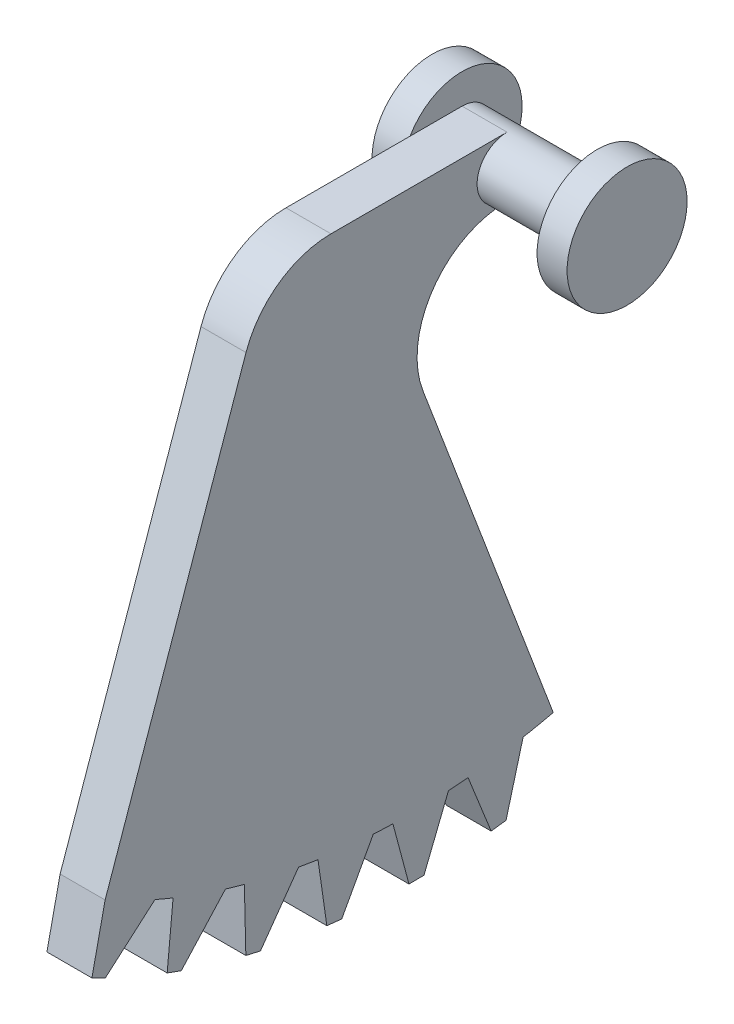
ISO-10303-21;
HEADER;
FILE_DESCRIPTION(('STEP AP214'),'2;1');
FILE_NAME('part.step','',(''),(''),'','','');
FILE_SCHEMA(('AUTOMOTIVE_DESIGN { 1 0 10303 214 1 1 1 1 }'));
ENDSEC;
DATA;
#1=APPLICATION_CONTEXT('core data for automotive mechanical design processes');
#2=APPLICATION_PROTOCOL_DEFINITION('international standard','automotive_design',2000,#1);
#3=PRODUCT_CONTEXT('',#1,'mechanical');
#4=PRODUCT('Part','Part','',(#3));
#5=PRODUCT_RELATED_PRODUCT_CATEGORY('part','',(#4));
#6=PRODUCT_DEFINITION_FORMATION('','',#4);
#7=PRODUCT_DEFINITION_CONTEXT('part definition',#1,'design');
#8=PRODUCT_DEFINITION('design','',#6,#7);
#9=PRODUCT_DEFINITION_SHAPE('','',#8);
#10=(LENGTH_UNIT() NAMED_UNIT(*) SI_UNIT(.MILLI.,.METRE.));
#11=(NAMED_UNIT(*) PLANE_ANGLE_UNIT() SI_UNIT($,.RADIAN.));
#12=(NAMED_UNIT(*) SI_UNIT($,.STERADIAN.) SOLID_ANGLE_UNIT());
#13=UNCERTAINTY_MEASURE_WITH_UNIT(LENGTH_MEASURE(1.E-05),#10,'distance_accuracy_value','');
#14=(GEOMETRIC_REPRESENTATION_CONTEXT(3) GLOBAL_UNCERTAINTY_ASSIGNED_CONTEXT((#13)) GLOBAL_UNIT_ASSIGNED_CONTEXT((#10,
#11,#12)) REPRESENTATION_CONTEXT('',''));
#15=CARTESIAN_POINT('',(0.,0.,0.));
#16=DIRECTION('',(0.,0.,1.));
#17=DIRECTION('',(1.,0.,0.));
#18=AXIS2_PLACEMENT_3D('',#15,#16,#17);
#19=CARTESIAN_POINT('',(-8.,8.12,6.47));
#20=DIRECTION('',(-1.,0.,0.));
#21=DIRECTION('',(0.,0.,1.));
#22=AXIS2_PLACEMENT_3D('',#19,#20,#21);
#23=CYLINDRICAL_SURFACE('',#22,42.26);
#24=DIRECTION('',(-1.,0.,0.));
#25=VECTOR('',#24,1.);
#26=CARTESIAN_POINT('',(-8.,-31.0770324874639,22.2655767282079));
#27=LINE('',#26,#25);
#28=CARTESIAN_POINT('',(-8.,-31.0770324874639,22.2655767282079));
#29=VERTEX_POINT('',#28);
#30=CARTESIAN_POINT('',(-11.,-31.0770324874639,22.2655767282079));
#31=VERTEX_POINT('',#30);
#32=EDGE_CURVE('E247',#29,#31,#27,.T.);
#33=ORIENTED_EDGE('',*,*,#32,.F.);
#34=CARTESIAN_POINT('',(-8.,8.12,6.47));
#35=DIRECTION('',(1.,0.,0.));
#36=DIRECTION('',(0.,0.,-1.));
#37=AXIS2_PLACEMENT_3D('',#34,#35,#36);
#38=CIRCLE('',#37,42.26);
#39=CARTESIAN_POINT('',(-8.,-30.5684682169388,23.4732357810775));
#40=VERTEX_POINT('',#39);
#41=EDGE_CURVE('E265',#40,#29,#38,.T.);
#42=ORIENTED_EDGE('',*,*,#41,.F.);
#43=DIRECTION('',(-1.,0.,0.));
#44=VECTOR('',#43,1.);
#45=CARTESIAN_POINT('',(-8.,-30.5684682169388,23.4732357810775));
#46=LINE('',#45,#44);
#47=CARTESIAN_POINT('',(-11.,-30.5684682169388,23.4732357810775));
#48=VERTEX_POINT('',#47);
#49=EDGE_CURVE('E304',#40,#48,#46,.T.);
#50=ORIENTED_EDGE('',*,*,#49,.T.);
#51=CARTESIAN_POINT('',(-11.,8.12,6.47));
#52=DIRECTION('',(1.,0.,0.));
#53=DIRECTION('',(0.,0.,-1.));
#54=AXIS2_PLACEMENT_3D('',#51,#52,#53);
#55=CIRCLE('',#54,42.26);
#56=EDGE_CURVE('E262',#48,#31,#55,.T.);
#57=ORIENTED_EDGE('',*,*,#56,.T.);
#58=EDGE_LOOP('',(#33,#42,#50,#57));
#59=FACE_BOUND('',#58,.T.);
#60=ADVANCED_FACE('F43',(#59),#23,.T.);
#61=CARTESIAN_POINT('',(-8.,-32.3095650914269,18.7727584922274));
#62=VERTEX_POINT('',#61);
#63=CARTESIAN_POINT('',(-8.,-32.6715602464926,17.5133786794062));
#64=VERTEX_POINT('',#63);
#65=EDGE_CURVE('E273',#62,#64,#38,.T.);
#66=ORIENTED_EDGE('',*,*,#65,.F.);
#67=DIRECTION('',(-1.,0.,0.));
#68=VECTOR('',#67,1.);
#69=CARTESIAN_POINT('',(-8.,-32.3095650914269,18.7727584922274));
#70=LINE('',#69,#68);
#71=CARTESIAN_POINT('',(-11.,-32.3095650914269,18.7727584922274));
#72=VERTEX_POINT('',#71);
#73=EDGE_CURVE('E421',#62,#72,#70,.T.);
#74=ORIENTED_EDGE('',*,*,#73,.T.);
#75=CARTESIAN_POINT('',(-11.,-32.6715602464926,17.5133786794062));
#76=VERTEX_POINT('',#75);
#77=EDGE_CURVE('E447',#72,#76,#55,.T.);
#78=ORIENTED_EDGE('',*,*,#77,.T.);
#79=DIRECTION('',(-1.,0.,0.));
#80=VECTOR('',#79,1.);
#81=CARTESIAN_POINT('',(-8.,-32.6715602464926,17.5133786794062));
#82=LINE('',#81,#80);
#83=EDGE_CURVE('E393',#64,#76,#82,.T.);
#84=ORIENTED_EDGE('',*,*,#83,.F.);
#85=EDGE_LOOP('',(#66,#74,#78,#84));
#86=FACE_BOUND('',#85,.T.);
#87=ADVANCED_FACE('F443',(#86),#23,.T.);
#88=CARTESIAN_POINT('',(-8.,-33.4818590701313,13.8991938936156));
#89=VERTEX_POINT('',#88);
#90=CARTESIAN_POINT('',(-8.,-33.69219220577,12.605811515011));
#91=VERTEX_POINT('',#90);
#92=EDGE_CURVE('E278',#89,#91,#38,.T.);
#93=ORIENTED_EDGE('',*,*,#92,.F.);
#94=DIRECTION('',(-1.,0.,0.));
#95=VECTOR('',#94,1.);
#96=CARTESIAN_POINT('',(-8.,-33.4818590701313,13.8991938936156));
#97=LINE('',#96,#95);
#98=CARTESIAN_POINT('',(-11.,-33.4818590701313,13.8991938936156));
#99=VERTEX_POINT('',#98);
#100=EDGE_CURVE('E402',#89,#99,#97,.T.);
#101=ORIENTED_EDGE('',*,*,#100,.T.);
#102=CARTESIAN_POINT('',(-11.,-33.69219220577,12.605811515011));
#103=VERTEX_POINT('',#102);
#104=EDGE_CURVE('E454',#99,#103,#55,.T.);
#105=ORIENTED_EDGE('',*,*,#104,.T.);
#106=DIRECTION('',(-1.,0.,0.));
#107=VECTOR('',#106,1.);
#108=CARTESIAN_POINT('',(-8.,-33.69219220577,12.605811515011));
#109=LINE('',#108,#107);
#110=EDGE_CURVE('E366',#91,#103,#109,.T.);
#111=ORIENTED_EDGE('',*,*,#110,.F.);
#112=EDGE_LOOP('',(#93,#101,#105,#111));
#113=FACE_BOUND('',#112,.T.);
#114=ADVANCED_FACE('F596',(#113),#23,.T.);
#115=CARTESIAN_POINT('',(-8.,-34.068857168072,8.92110808656464));
#116=VERTEX_POINT('',#115);
#117=CARTESIAN_POINT('',(-8.,-34.1245691108087,7.61191971789151));
#118=VERTEX_POINT('',#117);
#119=EDGE_CURVE('E287',#116,#118,#38,.T.);
#120=ORIENTED_EDGE('',*,*,#119,.F.);
#121=DIRECTION('',(-1.,0.,0.));
#122=VECTOR('',#121,1.);
#123=CARTESIAN_POINT('',(-8.,-34.068857168072,8.92110808656464));
#124=LINE('',#123,#122);
#125=CARTESIAN_POINT('',(-11.,-34.068857168072,8.92110808656464));
#126=VERTEX_POINT('',#125);
#127=EDGE_CURVE('E374',#116,#126,#124,.T.);
#128=ORIENTED_EDGE('',*,*,#127,.T.);
#129=CARTESIAN_POINT('',(-11.,-34.1245691108087,7.61191971789151));
#130=VERTEX_POINT('',#129);
#131=EDGE_CURVE('E460',#126,#130,#55,.T.);
#132=ORIENTED_EDGE('',*,*,#131,.T.);
#133=DIRECTION('',(-1.,0.,0.));
#134=VECTOR('',#133,1.);
#135=CARTESIAN_POINT('',(-8.,-34.1245691108087,7.61191971789151));
#136=LINE('',#135,#134);
#137=EDGE_CURVE('E341',#118,#130,#136,.T.);
#138=ORIENTED_EDGE('',*,*,#137,.F.);
#139=EDGE_LOOP('',(#120,#128,#132,#138));
#140=FACE_BOUND('',#139,.T.);
#141=ADVANCED_FACE('F527',(#140),#23,.T.);
#142=CARTESIAN_POINT('',(-8.,-34.0623009185261,3.9085376795838));
#143=VERTEX_POINT('',#142);
#144=CARTESIAN_POINT('',(-8.,-33.9626078579416,2.60196227077502));
#145=VERTEX_POINT('',#144);
#146=EDGE_CURVE('E282',#143,#145,#38,.T.);
#147=ORIENTED_EDGE('',*,*,#146,.F.);
#148=DIRECTION('',(-1.,0.,0.));
#149=VECTOR('',#148,1.);
#150=CARTESIAN_POINT('',(-8.,-34.0623009185261,3.9085376795838));
#151=LINE('',#150,#149);
#152=CARTESIAN_POINT('',(-11.,-34.0623009185261,3.9085376795838));
#153=VERTEX_POINT('',#152);
#154=EDGE_CURVE('E352',#143,#153,#151,.T.);
#155=ORIENTED_EDGE('',*,*,#154,.T.);
#156=CARTESIAN_POINT('',(-11.,-33.9626078579416,2.60196227077502));
#157=VERTEX_POINT('',#156);
#158=EDGE_CURVE('E513',#153,#157,#55,.T.);
#159=ORIENTED_EDGE('',*,*,#158,.T.);
#160=DIRECTION('',(-1.,0.,0.));
#161=VECTOR('',#160,1.);
#162=CARTESIAN_POINT('',(-8.,-33.9626078579416,2.60196227077502));
#163=LINE('',#162,#161);
#164=EDGE_CURVE('E321',#145,#157,#163,.T.);
#165=ORIENTED_EDGE('',*,*,#164,.F.);
#166=EDGE_LOOP('',(#147,#155,#159,#165));
#167=FACE_BOUND('',#166,.T.);
#168=ADVANCED_FACE('F545',(#167),#23,.T.);
#169=CARTESIAN_POINT('',(-11.,0.,0.));
#170=DIRECTION('',(1.,0.,0.));
#171=DIRECTION('',(0.,0.,-1.));
#172=AXIS2_PLACEMENT_3D('',#169,#170,#171);
#173=PLANE('',#172);
#174=CARTESIAN_POINT('',(-11.,0.,0.));
#175=DIRECTION('',(1.,0.,0.));
#176=DIRECTION('',(0.,0.,-1.));
#177=AXIS2_PLACEMENT_3D('',#174,#175,#176);
#178=CIRCLE('',#177,4.);
#179=CARTESIAN_POINT('',(-11.,-2.75,2.90473750965556));
#180=VERTEX_POINT('',#179);
#181=CARTESIAN_POINT('',(-11.,2.,3.46410161513775));
#182=VERTEX_POINT('',#181);
#183=EDGE_CURVE('E479',#180,#182,#178,.T.);
#184=ORIENTED_EDGE('',*,*,#183,.T.);
#185=DIRECTION('',(0.,0.,-1.));
#186=VECTOR('',#185,1.);
#187=CARTESIAN_POINT('',(-11.,2.,0.));
#188=LINE('',#187,#186);
#189=CARTESIAN_POINT('',(-11.,2.,0.));
#190=VERTEX_POINT('',#189);
#191=EDGE_CURVE('E299',#182,#190,#188,.T.);
#192=ORIENTED_EDGE('',*,*,#191,.T.);
#193=CARTESIAN_POINT('',(-11.,0.,0.));
#194=DIRECTION('',(1.,0.,0.));
#195=DIRECTION('',(0.,0.,-1.));
#196=AXIS2_PLACEMENT_3D('',#193,#194,#195);
#197=CIRCLE('',#196,2.);
#198=CARTESIAN_POINT('',(-11.,-2.,0.));
#199=VERTEX_POINT('',#198);
#200=EDGE_CURVE('E483',#199,#190,#197,.T.);
#201=ORIENTED_EDGE('',*,*,#200,.F.);
#202=CARTESIAN_POINT('',(-11.,-8.,0.));
#203=DIRECTION('',(1.,0.,0.));
#204=DIRECTION('',(0.,0.,-1.));
#205=AXIS2_PLACEMENT_3D('',#202,#203,#204);
#206=CIRCLE('',#205,6.);
#207=EDGE_CURVE('E296',#199,#180,#206,.T.);
#208=ORIENTED_EDGE('',*,*,#207,.T.);
#209=EDGE_LOOP('',(#184,#192,#201,#208));
#210=FACE_BOUND('',#209,.T.);
#211=ADVANCED_FACE('F571',(#210),#173,.T.);
#212=CARTESIAN_POINT('',(-2.,0.,0.));
#213=DIRECTION('',(1.,0.,0.));
#214=DIRECTION('',(0.,0.,-1.));
#215=AXIS2_PLACEMENT_3D('',#212,#213,#214);
#216=CYLINDRICAL_SURFACE('',#215,4.);
#217=CARTESIAN_POINT('',(-2.,0.,0.));
#218=DIRECTION('',(1.,0.,0.));
#219=DIRECTION('',(0.,0.,-1.));
#220=AXIS2_PLACEMENT_3D('',#217,#218,#219);
#221=CIRCLE('',#220,4.);
#222=CARTESIAN_POINT('',(-2.,0.,-4.));
#223=VERTEX_POINT('',#222);
#224=EDGE_CURVE('E492',#223,#223,#221,.T.);
#225=ORIENTED_EDGE('',*,*,#224,.T.);
#226=EDGE_LOOP('',(#225));
#227=FACE_BOUND('',#226,.T.);
#228=CARTESIAN_POINT('',(0.,0.,0.));
#229=DIRECTION('',(1.,0.,0.));
#230=DIRECTION('',(0.,0.,-1.));
#231=AXIS2_PLACEMENT_3D('',#228,#229,#230);
#232=CIRCLE('',#231,4.);
#233=CARTESIAN_POINT('',(0.,0.,-4.));
#234=VERTEX_POINT('',#233);
#235=EDGE_CURVE('E495',#234,#234,#232,.T.);
#236=ORIENTED_EDGE('',*,*,#235,.F.);
#237=EDGE_LOOP('',(#236));
#238=FACE_BOUND('',#237,.T.);
#239=ADVANCED_FACE('F608',(#227,#238),#216,.T.);
#240=CARTESIAN_POINT('',(-2.,0.,0.));
#241=DIRECTION('',(1.,0.,0.));
#242=DIRECTION('',(0.,0.,-1.));
#243=AXIS2_PLACEMENT_3D('',#240,#241,#242);
#244=PLANE('',#243);
#245=CARTESIAN_POINT('',(-2.,0.,0.));
#246=DIRECTION('',(1.,0.,0.));
#247=DIRECTION('',(0.,0.,-1.));
#248=AXIS2_PLACEMENT_3D('',#245,#246,#247);
#249=CIRCLE('',#248,2.);
#250=CARTESIAN_POINT('',(-2.,0.,-2.));
#251=VERTEX_POINT('',#250);
#252=EDGE_CURVE('E487',#251,#251,#249,.T.);
#253=ORIENTED_EDGE('',*,*,#252,.T.);
#254=EDGE_LOOP('',(#253));
#255=FACE_BOUND('',#254,.T.);
#256=ORIENTED_EDGE('',*,*,#224,.F.);
#257=EDGE_LOOP('',(#256));
#258=FACE_BOUND('',#257,.T.);
#259=ADVANCED_FACE('F929',(#255,#258),#244,.F.);
#260=CARTESIAN_POINT('',(0.,0.,0.));
#261=DIRECTION('',(1.,0.,0.));
#262=DIRECTION('',(0.,0.,-1.));
#263=AXIS2_PLACEMENT_3D('',#260,#261,#262);
#264=PLANE('',#263);
#265=ORIENTED_EDGE('',*,*,#235,.T.);
#266=EDGE_LOOP('',(#265));
#267=FACE_BOUND('',#266,.T.);
#268=ADVANCED_FACE('F590',(#267),#264,.T.);
#269=CARTESIAN_POINT('',(-11.,0.,0.));
#270=DIRECTION('',(1.,0.,0.));
#271=DIRECTION('',(0.,0.,-1.));
#272=AXIS2_PLACEMENT_3D('',#269,#270,#271);
#273=CYLINDRICAL_SURFACE('',#272,2.);
#274=DIRECTION('',(-1.,0.,0.));
#275=VECTOR('',#274,1.);
#276=CARTESIAN_POINT('',(-8.,2.,0.));
#277=LINE('',#276,#275);
#278=CARTESIAN_POINT('',(-8.,2.,0.));
#279=VERTEX_POINT('',#278);
#280=EDGE_CURVE('E465',#279,#190,#277,.T.);
#281=ORIENTED_EDGE('',*,*,#280,.F.);
#282=CARTESIAN_POINT('',(-8.,0.,0.));
#283=DIRECTION('',(1.,0.,0.));
#284=DIRECTION('',(0.,0.,-1.));
#285=AXIS2_PLACEMENT_3D('',#282,#283,#284);
#286=CIRCLE('',#285,2.);
#287=CARTESIAN_POINT('',(-8.,-2.,0.));
#288=VERTEX_POINT('',#287);
#289=EDGE_CURVE('E512',#288,#279,#286,.F.);
#290=ORIENTED_EDGE('',*,*,#289,.F.);
#291=DIRECTION('',(-1.,0.,0.));
#292=VECTOR('',#291,1.);
#293=CARTESIAN_POINT('',(-8.,-2.,0.));
#294=LINE('',#293,#292);
#295=EDGE_CURVE('E467',#288,#199,#294,.T.);
#296=ORIENTED_EDGE('',*,*,#295,.T.);
#297=ORIENTED_EDGE('',*,*,#200,.T.);
#298=EDGE_LOOP('',(#281,#290,#296,#297));
#299=FACE_BOUND('',#298,.T.);
#300=ORIENTED_EDGE('',*,*,#252,.F.);
#301=EDGE_LOOP('',(#300));
#302=FACE_BOUND('',#301,.T.);
#303=ADVANCED_FACE('F570',(#299,#302),#273,.T.);
#304=CARTESIAN_POINT('',(-13.,0.,0.));
#305=DIRECTION('',(1.,0.,0.));
#306=DIRECTION('',(0.,0.,-1.));
#307=AXIS2_PLACEMENT_3D('',#304,#305,#306);
#308=CYLINDRICAL_SURFACE('',#307,4.);
#309=CARTESIAN_POINT('',(-13.,0.,0.));
#310=DIRECTION('',(1.,0.,0.));
#311=DIRECTION('',(0.,0.,-1.));
#312=AXIS2_PLACEMENT_3D('',#309,#310,#311);
#313=CIRCLE('',#312,4.);
#314=CARTESIAN_POINT('',(-13.,0.,-4.));
#315=VERTEX_POINT('',#314);
#316=EDGE_CURVE('E477',#315,#315,#313,.T.);
#317=ORIENTED_EDGE('',*,*,#316,.T.);
#318=EDGE_LOOP('',(#317));
#319=FACE_BOUND('',#318,.T.);
#320=EDGE_CURVE('E482',#182,#180,#178,.T.);
#321=ORIENTED_EDGE('',*,*,#320,.F.);
#322=ORIENTED_EDGE('',*,*,#183,.F.);
#323=EDGE_LOOP('',(#321,#322));
#324=FACE_BOUND('',#323,.T.);
#325=ADVANCED_FACE('F575',(#319,#324),#308,.T.);
#326=CARTESIAN_POINT('',(-13.,0.,0.));
#327=DIRECTION('',(1.,0.,0.));
#328=DIRECTION('',(0.,0.,-1.));
#329=AXIS2_PLACEMENT_3D('',#326,#327,#328);
#330=PLANE('',#329);
#331=ORIENTED_EDGE('',*,*,#316,.F.);
#332=EDGE_LOOP('',(#331));
#333=FACE_BOUND('',#332,.T.);
#334=ADVANCED_FACE('F580',(#333),#330,.F.);
#335=CARTESIAN_POINT('',(-11.,0.,0.));
#336=DIRECTION('',(1.,0.,0.));
#337=DIRECTION('',(0.,0.,-1.));
#338=AXIS2_PLACEMENT_3D('',#335,#336,#337);
#339=PLANE('',#338);
#340=DIRECTION('',(0.,0.944146547885924,-0.329525865623767));
#341=VECTOR('',#340,1.);
#342=CARTESIAN_POINT('',(-11.,5.195105927715,14.8848446790941));
#343=LINE('',#342,#341);
#344=CARTESIAN_POINT('',(-11.,-28.9310423138733,26.7955470641153));
#345=VERTEX_POINT('',#344);
#346=CARTESIAN_POINT('',(-11.,-2.0228448062574,17.4040526018131));
#347=VERTEX_POINT('',#346);
#348=EDGE_CURVE('E305',#345,#347,#343,.T.);
#349=ORIENTED_EDGE('',*,*,#348,.T.);
#350=CARTESIAN_POINT('',(-11.,-4.,11.7391733144975));
#351=DIRECTION('',(1.,0.,0.));
#352=DIRECTION('',(0.,0.,-1.));
#353=AXIS2_PLACEMENT_3D('',#350,#351,#352);
#354=CIRCLE('',#353,6.);
#355=CARTESIAN_POINT('',(-11.,2.,11.7391733144975));
#356=VERTEX_POINT('',#355);
#357=EDGE_CURVE('E498',#347,#356,#354,.F.);
#358=ORIENTED_EDGE('',*,*,#357,.T.);
#359=EDGE_CURVE('E286',#356,#182,#188,.T.);
#360=ORIENTED_EDGE('',*,*,#359,.T.);
#361=ORIENTED_EDGE('',*,*,#320,.T.);
#362=CARTESIAN_POINT('',(-11.,-10.126725466906,5.610440159953));
#363=VERTEX_POINT('',#362);
#364=EDGE_CURVE('E464',#180,#363,#206,.T.);
#365=ORIENTED_EDGE('',*,*,#364,.T.);
#366=DIRECTION('',(0.,0.935073359992166,0.354454244484336));
#367=VECTOR('',#366,1.);
#368=CARTESIAN_POINT('',(-11.,-3.1318279583697,8.26196593078062));
#369=LINE('',#368,#367);
#370=CARTESIAN_POINT('',(-11.,-33.0472709861766,-3.07795263659715));
#371=VERTEX_POINT('',#370);
#372=EDGE_CURVE('E455',#371,#363,#369,.T.);
#373=ORIENTED_EDGE('',*,*,#372,.F.);
#374=CARTESIAN_POINT('',(-11.,-33.4622825612623,-1.06799555554028));
#375=VERTEX_POINT('',#374);
#376=EDGE_CURVE('E451',#375,#371,#55,.T.);
#377=ORIENTED_EDGE('',*,*,#376,.F.);
#378=DIRECTION('',(0.,-0.965744901133336,0.259493325415055));
#379=VECTOR('',#378,1.);
#380=CARTESIAN_POINT('',(-11.,3.00891069389777,-10.8677172092919));
#381=LINE('',#380,#379);
#382=CARTESIAN_POINT('',(-11.,-37.6950537450641,0.0693398514774388));
#383=VERTEX_POINT('',#382);
#384=EDGE_CURVE('E59',#375,#383,#381,.T.);
#385=ORIENTED_EDGE('',*,*,#384,.T.);
#386=DIRECTION('',(0.,-0.127650139538664,0.991819258673555));
#387=VECTOR('',#386,1.);
#388=CARTESIAN_POINT('',(-11.,-36.555646651557,-8.78365398694573));
#389=LINE('',#388,#387);
#390=CARTESIAN_POINT('',(-11.,-37.8227038846028,1.06115911015099));
#391=VERTEX_POINT('',#390);
#392=EDGE_CURVE('E334',#383,#391,#389,.T.);
#393=ORIENTED_EDGE('',*,*,#392,.T.);
#394=DIRECTION('',(0.,0.92874486425215,0.370719539713321));
#395=VECTOR('',#394,1.);
#396=CARTESIAN_POINT('',(-11.,-2.42778933630494,15.1894595019956));
#397=LINE('',#396,#395);
#398=EDGE_CURVE('E336',#391,#157,#397,.T.);
#399=ORIENTED_EDGE('',*,*,#398,.T.);
#400=ORIENTED_EDGE('',*,*,#158,.F.);
#401=DIRECTION('',(0.,-0.928226336976967,0.372015950386971));
#402=VECTOR('',#401,1.);
#403=CARTESIAN_POINT('',(-11.,0.992010091232233,-10.1405819219206));
#404=LINE('',#403,#402);
#405=CARTESIAN_POINT('',(-11.,-38.1306316822623,5.53904941499626));
#406=VERTEX_POINT('',#405);
#407=EDGE_CURVE('E68',#153,#406,#404,.T.);
#408=ORIENTED_EDGE('',*,*,#407,.T.);
#409=DIRECTION('',(0.,-0.00931684959711915,0.999956597214892));
#410=VECTOR('',#409,1.);
#411=CARTESIAN_POINT('',(-11.,-38.0474693405801,-3.38657843142546));
#412=LINE('',#411,#410);
#413=CARTESIAN_POINT('',(-11.,-38.1399485318594,6.53900601221114));
#414=VERTEX_POINT('',#413);
#415=EDGE_CURVE('E360',#406,#414,#412,.T.);
#416=ORIENTED_EDGE('',*,*,#415,.T.);
#417=DIRECTION('',(0.,0.966106280664289,0.258144638644721));
#418=VECTOR('',#417,1.);
#419=CARTESIAN_POINT('',(-11.,-1.32117239120064,16.3770226490929));
#420=LINE('',#419,#418);
#421=EDGE_CURVE('E323',#414,#130,#420,.T.);
#422=ORIENTED_EDGE('',*,*,#421,.T.);
#423=ORIENTED_EDGE('',*,*,#131,.F.);
#424=DIRECTION('',(0.,-0.877648571535072,0.479304688984416));
#425=VECTOR('',#424,1.);
#426=CARTESIAN_POINT('',(-11.,-0.924606936973481,-9.17975262679832));
#427=LINE('',#426,#425);
#428=CARTESIAN_POINT('',(-11.,-37.9155102321875,11.0218565072019));
#429=VERTEX_POINT('',#428);
#430=EDGE_CURVE('E377',#126,#429,#427,.T.);
#431=ORIENTED_EDGE('',*,*,#430,.T.);
#432=DIRECTION('',(0.,0.109147518950353,0.994025562602382));
#433=VECTOR('',#432,1.);
#434=CARTESIAN_POINT('',(-11.,-38.8897626519671,2.14916916624109));
#435=LINE('',#434,#433);
#436=CARTESIAN_POINT('',(-11.,-37.8063627132372,12.0158820698043));
#437=VERTEX_POINT('',#436);
#438=EDGE_CURVE('E382',#429,#437,#435,.T.);
#439=ORIENTED_EDGE('',*,*,#438,.T.);
#440=DIRECTION('',(0.,0.989875563477315,0.141937904840348));
#441=VECTOR('',#440,1.);
#442=CARTESIAN_POINT('',(-11.,-0.0817277447949629,17.4252040551635));
#443=LINE('',#442,#441);
#444=EDGE_CURVE('E350',#437,#103,#443,.T.);
#445=ORIENTED_EDGE('',*,*,#444,.T.);
#446=ORIENTED_EDGE('',*,*,#104,.F.);
#447=DIRECTION('',(0.,-0.814723182569631,0.579850097683541));
#448=VECTOR('',#447,1.);
#449=CARTESIAN_POINT('',(-11.,-2.71397553682379,-7.99874721570024));
#450=LINE('',#449,#448);
#451=CARTESIAN_POINT('',(-11.,-37.0527159350333,16.4406236040073));
#452=VERTEX_POINT('',#451);
#453=EDGE_CURVE('E403',#99,#452,#450,.T.);
#454=ORIENTED_EDGE('',*,*,#453,.T.);
#455=DIRECTION('',(0.,0.22607629282333,0.97410959846583));
#456=VECTOR('',#455,1.);
#457=CARTESIAN_POINT('',(-11.,-39.0706763747763,7.74570646285385));
#458=LINE('',#457,#456);
#459=CARTESIAN_POINT('',(-11.,-36.82663964221,17.4147332024732));
#460=VERTEX_POINT('',#459);
#461=EDGE_CURVE('E408',#452,#460,#458,.T.);
#462=ORIENTED_EDGE('',*,*,#461,.T.);
#463=DIRECTION('',(0.,0.999718303036705,0.0237342489540253));
#464=VECTOR('',#463,1.);
#465=CARTESIAN_POINT('',(-11.,1.27310687627701,18.3192568729994));
#466=LINE('',#465,#464);
#467=EDGE_CURVE('E367',#460,#76,#466,.T.);
#468=ORIENTED_EDGE('',*,*,#467,.T.);
#469=ORIENTED_EDGE('',*,*,#77,.F.);
#470=DIRECTION('',(0.,-0.740335466357785,0.672237604759509));
#471=VECTOR('',#470,1.);
#472=CARTESIAN_POINT('',(-11.,-4.35092111049858,-6.61418123460734));
#473=LINE('',#472,#471);
#474=CARTESIAN_POINT('',(-11.,-35.5543874297777,21.7191141589824));
#475=VERTEX_POINT('',#474);
#476=EDGE_CURVE('E258',#72,#475,#473,.T.);
#477=ORIENTED_EDGE('',*,*,#476,.T.);
#478=DIRECTION('',(0.,0.339824402997967,0.940488902181773));
#479=VECTOR('',#478,1.);
#480=CARTESIAN_POINT('',(-11.,-38.5876652367748,13.3242958659238));
#481=LINE('',#480,#479);
#482=CARTESIAN_POINT('',(-11.,-35.2145630267797,22.6596030611642));
#483=VERTEX_POINT('',#482);
#484=EDGE_CURVE('E427',#475,#483,#481,.T.);
#485=ORIENTED_EDGE('',*,*,#484,.T.);
#486=DIRECTION('',(0.,0.995496021999177,-0.0948033236960264));
#487=VECTOR('',#486,1.);
#488=CARTESIAN_POINT('',(-11.,2.72427032569747,19.046602688002));
#489=LINE('',#488,#487);
#490=EDGE_CURVE('E398',#483,#31,#489,.T.);
#491=ORIENTED_EDGE('',*,*,#490,.T.);
#492=ORIENTED_EDGE('',*,*,#56,.F.);
#493=DIRECTION('',(0.,-0.655531982472865,0.755167411873153));
#494=VECTOR('',#493,1.);
#495=CARTESIAN_POINT('',(-11.,-5.81241349726172,-5.04553411985954));
#496=LINE('',#495,#494);
#497=CARTESIAN_POINT('',(-11.,-33.4416046758686,26.7830651740898));
#498=VERTEX_POINT('',#497);
#499=EDGE_CURVE('E307',#48,#498,#496,.T.);
#500=ORIENTED_EDGE('',*,*,#499,.T.);
#501=DIRECTION('',(0.,0.448791529156423,0.893636482781136));
#502=VECTOR('',#501,1.);
#503=CARTESIAN_POINT('',(-11.,-37.4475247138319,18.8064522915853));
#504=LINE('',#503,#502);
#505=CARTESIAN_POINT('',(-11.,-32.9928131467121,27.676701656871));
#506=VERTEX_POINT('',#505);
#507=EDGE_CURVE('E313',#498,#506,#504,.T.);
#508=ORIENTED_EDGE('',*,*,#507,.T.);
#509=DIRECTION('',(0.,0.977268123568194,-0.212007109922052));
#510=VECTOR('',#509,1.);
#511=CARTESIAN_POINT('',(-11.,4.25134620842432,19.5970084836926));
#512=LINE('',#511,#510);
#513=EDGE_CURVE('E264',#506,#345,#512,.T.);
#514=ORIENTED_EDGE('',*,*,#513,.T.);
#515=EDGE_LOOP('',(#349,#358,#360,#361,#365,#373,#377,#385,#393,#399,#400,#408,#416,#422,#423,
#431,#439,#445,#446,#454,#462,#468,#469,#477,#485,#491,#492,#500,#508,#514));
#516=FACE_BOUND('',#515,.T.);
#517=ADVANCED_FACE('F450',(#516),#339,.F.);
#518=CARTESIAN_POINT('',(-8.,5.195105927715,14.8848446790941));
#519=DIRECTION('',(0.,0.329525865623767,0.944146547885924));
#520=DIRECTION('',(0.,-0.944146547885924,0.329525865623767));
#521=AXIS2_PLACEMENT_3D('',#518,#519,#520);
#522=PLANE('',#521);
#523=DIRECTION('',(0.,0.944146547885924,-0.329525865623767));
#524=VECTOR('',#523,1.);
#525=CARTESIAN_POINT('',(-8.,5.195105927715,14.8848446790941));
#526=LINE('',#525,#524);
#527=CARTESIAN_POINT('',(-8.,-28.9310423138733,26.7955470641153));
#528=VERTEX_POINT('',#527);
#529=CARTESIAN_POINT('',(-8.,-2.0228448062574,17.4040526018131));
#530=VERTEX_POINT('',#529);
#531=EDGE_CURVE('E284',#528,#530,#526,.T.);
#532=ORIENTED_EDGE('',*,*,#531,.T.);
#533=DIRECTION('',(-1.,0.,0.));
#534=VECTOR('',#533,1.);
#535=CARTESIAN_POINT('',(-8.,-2.0228448062574,17.4040526018131));
#536=LINE('',#535,#534);
#537=EDGE_CURVE('E499',#530,#347,#536,.T.);
#538=ORIENTED_EDGE('',*,*,#537,.T.);
#539=ORIENTED_EDGE('',*,*,#348,.F.);
#540=DIRECTION('',(-1.,0.,0.));
#541=VECTOR('',#540,1.);
#542=CARTESIAN_POINT('',(-8.,-28.9310423138733,26.7955470641153));
#543=LINE('',#542,#541);
#544=EDGE_CURVE('E480',#528,#345,#543,.T.);
#545=ORIENTED_EDGE('',*,*,#544,.F.);
#546=EDGE_LOOP('',(#532,#538,#539,#545));
#547=FACE_BOUND('',#546,.T.);
#548=ADVANCED_FACE('F511',(#547),#522,.T.);
#549=CARTESIAN_POINT('',(-8.,-33.4622825612623,-1.06799555554028));
#550=VERTEX_POINT('',#549);
#551=CARTESIAN_POINT('',(-8.,-33.0472709861766,-3.07795263659715));
#552=VERTEX_POINT('',#551);
#553=EDGE_CURVE('E277',#550,#552,#38,.T.);
#554=ORIENTED_EDGE('',*,*,#553,.F.);
#555=DIRECTION('',(-1.,0.,0.));
#556=VECTOR('',#555,1.);
#557=CARTESIAN_POINT('',(-8.,-33.4622825612623,-1.06799555554028));
#558=LINE('',#557,#556);
#559=EDGE_CURVE('E327',#550,#375,#558,.T.);
#560=ORIENTED_EDGE('',*,*,#559,.T.);
#561=ORIENTED_EDGE('',*,*,#376,.T.);
#562=DIRECTION('',(-1.,0.,0.));
#563=VECTOR('',#562,1.);
#564=CARTESIAN_POINT('',(-8.,-33.0472709861766,-3.07795263659715));
#565=LINE('',#564,#563);
#566=EDGE_CURVE('E475',#552,#371,#565,.T.);
#567=ORIENTED_EDGE('',*,*,#566,.F.);
#568=EDGE_LOOP('',(#554,#560,#561,#567));
#569=FACE_BOUND('',#568,.T.);
#570=ADVANCED_FACE('F552',(#569),#23,.T.);
#571=CARTESIAN_POINT('',(-8.,-3.1318279583697,8.26196593078062));
#572=DIRECTION('',(0.,-0.354454244484336,0.935073359992166));
#573=DIRECTION('',(0.,-0.935073359992166,-0.354454244484336));
#574=AXIS2_PLACEMENT_3D('',#571,#572,#573);
#575=PLANE('',#574);
#576=ORIENTED_EDGE('',*,*,#372,.T.);
#577=DIRECTION('',(-1.,0.,0.));
#578=VECTOR('',#577,1.);
#579=CARTESIAN_POINT('',(-8.,-10.126725466906,5.610440159953));
#580=LINE('',#579,#578);
#581=CARTESIAN_POINT('',(-8.,-10.126725466906,5.610440159953));
#582=VERTEX_POINT('',#581);
#583=EDGE_CURVE('E473',#582,#363,#580,.T.);
#584=ORIENTED_EDGE('',*,*,#583,.F.);
#585=DIRECTION('',(0.,0.935073359992166,0.354454244484336));
#586=VECTOR('',#585,1.);
#587=CARTESIAN_POINT('',(-8.,-3.1318279583697,8.26196593078062));
#588=LINE('',#587,#586);
#589=EDGE_CURVE('E272',#552,#582,#588,.T.);
#590=ORIENTED_EDGE('',*,*,#589,.F.);
#591=ORIENTED_EDGE('',*,*,#566,.T.);
#592=EDGE_LOOP('',(#576,#584,#590,#591));
#593=FACE_BOUND('',#592,.T.);
#594=ADVANCED_FACE('F556',(#593),#575,.F.);
#595=CARTESIAN_POINT('',(-8.,-8.,0.));
#596=DIRECTION('',(-1.,0.,0.));
#597=DIRECTION('',(0.,0.,1.));
#598=AXIS2_PLACEMENT_3D('',#595,#596,#597);
#599=CYLINDRICAL_SURFACE('',#598,6.);
#600=ORIENTED_EDGE('',*,*,#207,.F.);
#601=ORIENTED_EDGE('',*,*,#295,.F.);
#602=CARTESIAN_POINT('',(-8.,-8.,0.));
#603=DIRECTION('',(1.,0.,0.));
#604=DIRECTION('',(0.,0.,-1.));
#605=AXIS2_PLACEMENT_3D('',#602,#603,#604);
#606=CIRCLE('',#605,6.);
#607=EDGE_CURVE('E280',#288,#582,#606,.T.);
#608=ORIENTED_EDGE('',*,*,#607,.T.);
#609=ORIENTED_EDGE('',*,*,#583,.T.);
#610=ORIENTED_EDGE('',*,*,#364,.F.);
#611=EDGE_LOOP('',(#600,#601,#608,#609,#610));
#612=FACE_BOUND('',#611,.T.);
#613=ADVANCED_FACE('F565',(#612),#599,.F.);
#614=CARTESIAN_POINT('',(-8.,2.,0.));
#615=DIRECTION('',(0.,1.,0.));
#616=DIRECTION('',(0.,0.,1.));
#617=AXIS2_PLACEMENT_3D('',#614,#615,#616);
#618=PLANE('',#617);
#619=ORIENTED_EDGE('',*,*,#359,.F.);
#620=DIRECTION('',(-1.,0.,0.));
#621=VECTOR('',#620,1.);
#622=CARTESIAN_POINT('',(-8.,2.,11.7391733144975));
#623=LINE('',#622,#621);
#624=CARTESIAN_POINT('',(-8.,2.,11.7391733144975));
#625=VERTEX_POINT('',#624);
#626=EDGE_CURVE('E51',#356,#625,#623,.F.);
#627=ORIENTED_EDGE('',*,*,#626,.T.);
#628=DIRECTION('',(0.,0.,-1.));
#629=VECTOR('',#628,1.);
#630=CARTESIAN_POINT('',(-8.,2.,0.));
#631=LINE('',#630,#629);
#632=EDGE_CURVE('E468',#625,#279,#631,.T.);
#633=ORIENTED_EDGE('',*,*,#632,.T.);
#634=ORIENTED_EDGE('',*,*,#280,.T.);
#635=ORIENTED_EDGE('',*,*,#191,.F.);
#636=EDGE_LOOP('',(#619,#627,#633,#634,#635));
#637=FACE_BOUND('',#636,.T.);
#638=ADVANCED_FACE('F503',(#637),#618,.T.);
#639=CARTESIAN_POINT('',(-8.,0.,0.));
#640=DIRECTION('',(1.,0.,0.));
#641=DIRECTION('',(0.,0.,-1.));
#642=AXIS2_PLACEMENT_3D('',#639,#640,#641);
#643=PLANE('',#642);
#644=ORIENTED_EDGE('',*,*,#632,.F.);
#645=CARTESIAN_POINT('',(-8.,-4.,11.7391733144975));
#646=DIRECTION('',(1.,0.,0.));
#647=DIRECTION('',(0.,0.,-1.));
#648=AXIS2_PLACEMENT_3D('',#645,#646,#647);
#649=CIRCLE('',#648,6.);
#650=EDGE_CURVE('E11',#625,#530,#649,.T.);
#651=ORIENTED_EDGE('',*,*,#650,.T.);
#652=ORIENTED_EDGE('',*,*,#531,.F.);
#653=DIRECTION('',(0.,0.977268123568194,-0.212007109922052));
#654=VECTOR('',#653,1.);
#655=CARTESIAN_POINT('',(-8.,4.25134620842432,19.5970084836926));
#656=LINE('',#655,#654);
#657=CARTESIAN_POINT('',(-8.,-32.9928131467121,27.676701656871));
#658=VERTEX_POINT('',#657);
#659=EDGE_CURVE('E309',#658,#528,#656,.T.);
#660=ORIENTED_EDGE('',*,*,#659,.F.);
#661=DIRECTION('',(0.,0.448791529156423,0.893636482781136));
#662=VECTOR('',#661,1.);
#663=CARTESIAN_POINT('',(-8.,-37.4475247138319,18.8064522915853));
#664=LINE('',#663,#662);
#665=CARTESIAN_POINT('',(-8.,-33.4416046758686,26.7830651740898));
#666=VERTEX_POINT('',#665);
#667=EDGE_CURVE('E320',#666,#658,#664,.T.);
#668=ORIENTED_EDGE('',*,*,#667,.F.);
#669=DIRECTION('',(0.,-0.655531982472865,0.755167411873153));
#670=VECTOR('',#669,1.);
#671=CARTESIAN_POINT('',(-8.,-5.81241349726172,-5.04553411985954));
#672=LINE('',#671,#670);
#673=EDGE_CURVE('E275',#40,#666,#672,.T.);
#674=ORIENTED_EDGE('',*,*,#673,.F.);
#675=ORIENTED_EDGE('',*,*,#41,.T.);
#676=DIRECTION('',(0.,0.995496021999177,-0.0948033236960264));
#677=VECTOR('',#676,1.);
#678=CARTESIAN_POINT('',(-8.,2.72427032569747,19.046602688002));
#679=LINE('',#678,#677);
#680=CARTESIAN_POINT('',(-8.,-35.2145630267797,22.6596030611642));
#681=VERTEX_POINT('',#680);
#682=EDGE_CURVE('E243',#681,#29,#679,.T.);
#683=ORIENTED_EDGE('',*,*,#682,.F.);
#684=DIRECTION('',(0.,0.339824402997967,0.940488902181773));
#685=VECTOR('',#684,1.);
#686=CARTESIAN_POINT('',(-8.,-38.5876652367748,13.3242958659238));
#687=LINE('',#686,#685);
#688=CARTESIAN_POINT('',(-8.,-35.5543874297777,21.7191141589824));
#689=VERTEX_POINT('',#688);
#690=EDGE_CURVE('E254',#689,#681,#687,.T.);
#691=ORIENTED_EDGE('',*,*,#690,.F.);
#692=DIRECTION('',(0.,-0.740335466357785,0.672237604759509));
#693=VECTOR('',#692,1.);
#694=CARTESIAN_POINT('',(-8.,-4.35092111049858,-6.61418123460734));
#695=LINE('',#694,#693);
#696=EDGE_CURVE('E426',#62,#689,#695,.T.);
#697=ORIENTED_EDGE('',*,*,#696,.F.);
#698=ORIENTED_EDGE('',*,*,#65,.T.);
#699=DIRECTION('',(0.,0.999718303036705,0.0237342489540253));
#700=VECTOR('',#699,1.);
#701=CARTESIAN_POINT('',(-8.,1.27310687627701,18.3192568729994));
#702=LINE('',#701,#700);
#703=CARTESIAN_POINT('',(-8.,-36.82663964221,17.4147332024732));
#704=VERTEX_POINT('',#703);
#705=EDGE_CURVE('E409',#704,#64,#702,.T.);
#706=ORIENTED_EDGE('',*,*,#705,.F.);
#707=DIRECTION('',(0.,0.22607629282333,0.97410959846583));
#708=VECTOR('',#707,1.);
#709=CARTESIAN_POINT('',(-8.,-39.0706763747763,7.74570646285385));
#710=LINE('',#709,#708);
#711=CARTESIAN_POINT('',(-8.,-37.0527159350333,16.4406236040073));
#712=VERTEX_POINT('',#711);
#713=EDGE_CURVE('E418',#712,#704,#710,.T.);
#714=ORIENTED_EDGE('',*,*,#713,.F.);
#715=DIRECTION('',(0.,-0.814723182569631,0.579850097683541));
#716=VECTOR('',#715,1.);
#717=CARTESIAN_POINT('',(-8.,-2.71397553682379,-7.99874721570024));
#718=LINE('',#717,#716);
#719=EDGE_CURVE('E404',#89,#712,#718,.T.);
#720=ORIENTED_EDGE('',*,*,#719,.F.);
#721=ORIENTED_EDGE('',*,*,#92,.T.);
#722=DIRECTION('',(0.,0.989875563477315,0.141937904840348));
#723=VECTOR('',#722,1.);
#724=CARTESIAN_POINT('',(-8.,-0.0817277447949629,17.4252040551635));
#725=LINE('',#724,#723);
#726=CARTESIAN_POINT('',(-8.,-37.8063627132372,12.0158820698043));
#727=VERTEX_POINT('',#726);
#728=EDGE_CURVE('E385',#727,#91,#725,.T.);
#729=ORIENTED_EDGE('',*,*,#728,.F.);
#730=DIRECTION('',(0.,0.109147518950353,0.994025562602382));
#731=VECTOR('',#730,1.);
#732=CARTESIAN_POINT('',(-8.,-38.8897626519671,2.14916916624109));
#733=LINE('',#732,#731);
#734=CARTESIAN_POINT('',(-8.,-37.9155102321875,11.0218565072019));
#735=VERTEX_POINT('',#734);
#736=EDGE_CURVE('E388',#735,#727,#733,.T.);
#737=ORIENTED_EDGE('',*,*,#736,.F.);
#738=DIRECTION('',(0.,-0.877648571535072,0.479304688984416));
#739=VECTOR('',#738,1.);
#740=CARTESIAN_POINT('',(-8.,-0.924606936973481,-9.17975262679832));
#741=LINE('',#740,#739);
#742=EDGE_CURVE('E378',#116,#735,#741,.T.);
#743=ORIENTED_EDGE('',*,*,#742,.F.);
#744=ORIENTED_EDGE('',*,*,#119,.T.);
#745=DIRECTION('',(0.,0.966106280664289,0.258144638644721));
#746=VECTOR('',#745,1.);
#747=CARTESIAN_POINT('',(-8.,-1.32117239120064,16.3770226490929));
#748=LINE('',#747,#746);
#749=CARTESIAN_POINT('',(-8.,-38.1399485318594,6.53900601221114));
#750=VERTEX_POINT('',#749);
#751=EDGE_CURVE('E356',#750,#118,#748,.T.);
#752=ORIENTED_EDGE('',*,*,#751,.F.);
#753=DIRECTION('',(0.,-0.00931684959711915,0.999956597214892));
#754=VECTOR('',#753,1.);
#755=CARTESIAN_POINT('',(-8.,-38.0474693405801,-3.38657843142546));
#756=LINE('',#755,#754);
#757=CARTESIAN_POINT('',(-8.,-38.1306316822623,5.53904941499626));
#758=VERTEX_POINT('',#757);
#759=EDGE_CURVE('E365',#758,#750,#756,.T.);
#760=ORIENTED_EDGE('',*,*,#759,.F.);
#761=DIRECTION('',(0.,-0.928226336976967,0.372015950386971));
#762=VECTOR('',#761,1.);
#763=CARTESIAN_POINT('',(-8.,0.992010091232233,-10.1405819219206));
#764=LINE('',#763,#762);
#765=EDGE_CURVE('E353',#143,#758,#764,.T.);
#766=ORIENTED_EDGE('',*,*,#765,.F.);
#767=ORIENTED_EDGE('',*,*,#146,.T.);
#768=DIRECTION('',(0.,0.92874486425215,0.370719539713321));
#769=VECTOR('',#768,1.);
#770=CARTESIAN_POINT('',(-8.,-2.42778933630494,15.1894595019956));
#771=LINE('',#770,#769);
#772=CARTESIAN_POINT('',(-8.,-37.8227038846028,1.06115911015099));
#773=VERTEX_POINT('',#772);
#774=EDGE_CURVE('E335',#773,#145,#771,.T.);
#775=ORIENTED_EDGE('',*,*,#774,.F.);
#776=DIRECTION('',(0.,-0.127650139538664,0.991819258673555));
#777=VECTOR('',#776,1.);
#778=CARTESIAN_POINT('',(-8.,-36.555646651557,-8.78365398694573));
#779=LINE('',#778,#777);
#780=CARTESIAN_POINT('',(-8.,-37.6950537450641,0.0693398514774388));
#781=VERTEX_POINT('',#780);
#782=EDGE_CURVE('E343',#781,#773,#779,.T.);
#783=ORIENTED_EDGE('',*,*,#782,.F.);
#784=DIRECTION('',(0.,-0.965744901133336,0.259493325415055));
#785=VECTOR('',#784,1.);
#786=CARTESIAN_POINT('',(-8.,3.00891069389777,-10.8677172092919));
#787=LINE('',#786,#785);
#788=EDGE_CURVE('E329',#550,#781,#787,.T.);
#789=ORIENTED_EDGE('',*,*,#788,.F.);
#790=ORIENTED_EDGE('',*,*,#553,.T.);
#791=ORIENTED_EDGE('',*,*,#589,.T.);
#792=ORIENTED_EDGE('',*,*,#607,.F.);
#793=ORIENTED_EDGE('',*,*,#289,.T.);
#794=EDGE_LOOP('',(#644,#651,#652,#660,#668,#674,#675,#683,#691,#697,#698,#706,#714,#720,#721,
#729,#737,#743,#744,#752,#760,#766,#767,#775,#783,#789,#790,#791,#792,#793));
#795=FACE_BOUND('',#794,.T.);
#796=ADVANCED_FACE('F267',(#795),#643,.T.);
#797=CARTESIAN_POINT('',(-8.,-4.,11.7391733144975));
#798=DIRECTION('',(-1.,0.,0.));
#799=DIRECTION('',(0.,0.,1.));
#800=AXIS2_PLACEMENT_3D('',#797,#798,#799);
#801=CYLINDRICAL_SURFACE('',#800,6.);
#802=ORIENTED_EDGE('',*,*,#650,.F.);
#803=ORIENTED_EDGE('',*,*,#626,.F.);
#804=ORIENTED_EDGE('',*,*,#357,.F.);
#805=ORIENTED_EDGE('',*,*,#537,.F.);
#806=EDGE_LOOP('',(#802,#803,#804,#805));
#807=FACE_BOUND('',#806,.T.);
#808=ADVANCED_FACE('F44',(#807),#801,.T.);
#809=CARTESIAN_POINT('',(-8.,4.25134620842432,19.5970084836926));
#810=DIRECTION('',(0.,0.212007109922052,0.977268123568194));
#811=DIRECTION('',(0.,-0.977268123568194,0.212007109922052));
#812=AXIS2_PLACEMENT_3D('',#809,#810,#811);
#813=PLANE('',#812);
#814=ORIENTED_EDGE('',*,*,#513,.F.);
#815=DIRECTION('',(-1.,0.,0.));
#816=VECTOR('',#815,1.);
#817=CARTESIAN_POINT('',(-8.,-32.9928131467121,27.676701656871));
#818=LINE('',#817,#816);
#819=EDGE_CURVE('E300',#658,#506,#818,.T.);
#820=ORIENTED_EDGE('',*,*,#819,.F.);
#821=ORIENTED_EDGE('',*,*,#659,.T.);
#822=ORIENTED_EDGE('',*,*,#544,.T.);
#823=EDGE_LOOP('',(#814,#820,#821,#822));
#824=FACE_BOUND('',#823,.T.);
#825=ADVANCED_FACE('F670',(#824),#813,.T.);
#826=CARTESIAN_POINT('',(-8.,-37.4475247138319,18.8064522915853));
#827=DIRECTION('',(0.,-0.893636482781136,0.448791529156423));
#828=DIRECTION('',(0.,-0.448791529156423,-0.893636482781136));
#829=AXIS2_PLACEMENT_3D('',#826,#827,#828);
#830=PLANE('',#829);
#831=ORIENTED_EDGE('',*,*,#507,.F.);
#832=DIRECTION('',(-1.,0.,0.));
#833=VECTOR('',#832,1.);
#834=CARTESIAN_POINT('',(-8.,-33.4416046758686,26.7830651740898));
#835=LINE('',#834,#833);
#836=EDGE_CURVE('E302',#666,#498,#835,.T.);
#837=ORIENTED_EDGE('',*,*,#836,.F.);
#838=ORIENTED_EDGE('',*,*,#667,.T.);
#839=ORIENTED_EDGE('',*,*,#819,.T.);
#840=EDGE_LOOP('',(#831,#837,#838,#839));
#841=FACE_BOUND('',#840,.T.);
#842=ADVANCED_FACE('F666',(#841),#830,.T.);
#843=CARTESIAN_POINT('',(-8.,-5.81241349726172,-5.04553411985954));
#844=DIRECTION('',(0.,-0.755167411873153,-0.655531982472865));
#845=DIRECTION('',(0.,0.655531982472865,-0.755167411873153));
#846=AXIS2_PLACEMENT_3D('',#843,#844,#845);
#847=PLANE('',#846);
#848=ORIENTED_EDGE('',*,*,#499,.F.);
#849=ORIENTED_EDGE('',*,*,#49,.F.);
#850=ORIENTED_EDGE('',*,*,#673,.T.);
#851=ORIENTED_EDGE('',*,*,#836,.T.);
#852=EDGE_LOOP('',(#848,#849,#850,#851));
#853=FACE_BOUND('',#852,.T.);
#854=ADVANCED_FACE('F661',(#853),#847,.T.);
#855=CARTESIAN_POINT('',(-8.,-2.42778933630494,15.1894595019956));
#856=DIRECTION('',(0.,-0.37071953971332,0.92874486425215));
#857=DIRECTION('',(0.,-0.92874486425215,-0.370719539713321));
#858=AXIS2_PLACEMENT_3D('',#855,#856,#857);
#859=PLANE('',#858);
#860=ORIENTED_EDGE('',*,*,#398,.F.);
#861=DIRECTION('',(-1.,0.,0.));
#862=VECTOR('',#861,1.);
#863=CARTESIAN_POINT('',(-8.,-37.8227038846028,1.06115911015099));
#864=LINE('',#863,#862);
#865=EDGE_CURVE('E322',#773,#391,#864,.T.);
#866=ORIENTED_EDGE('',*,*,#865,.F.);
#867=ORIENTED_EDGE('',*,*,#774,.T.);
#868=ORIENTED_EDGE('',*,*,#164,.T.);
#869=EDGE_LOOP('',(#860,#866,#867,#868));
#870=FACE_BOUND('',#869,.T.);
#871=ADVANCED_FACE('F544',(#870),#859,.T.);
#872=CARTESIAN_POINT('',(-8.,-36.555646651557,-8.78365398694573));
#873=DIRECTION('',(0.,-0.991819258673555,-0.127650139538664));
#874=DIRECTION('',(0.,0.127650139538664,-0.991819258673555));
#875=AXIS2_PLACEMENT_3D('',#872,#873,#874);
#876=PLANE('',#875);
#877=ORIENTED_EDGE('',*,*,#392,.F.);
#878=DIRECTION('',(-1.,0.,0.));
#879=VECTOR('',#878,1.);
#880=CARTESIAN_POINT('',(-8.,-37.6950537450641,0.0693398514774388));
#881=LINE('',#880,#879);
#882=EDGE_CURVE('E326',#781,#383,#881,.T.);
#883=ORIENTED_EDGE('',*,*,#882,.F.);
#884=ORIENTED_EDGE('',*,*,#782,.T.);
#885=ORIENTED_EDGE('',*,*,#865,.T.);
#886=EDGE_LOOP('',(#877,#883,#884,#885));
#887=FACE_BOUND('',#886,.T.);
#888=ADVANCED_FACE('F547',(#887),#876,.T.);
#889=CARTESIAN_POINT('',(-8.,3.00891069389777,-10.8677172092919));
#890=DIRECTION('',(0.,-0.259493325415055,-0.965744901133336));
#891=DIRECTION('',(0.,0.965744901133336,-0.259493325415055));
#892=AXIS2_PLACEMENT_3D('',#889,#890,#891);
#893=PLANE('',#892);
#894=ORIENTED_EDGE('',*,*,#384,.F.);
#895=ORIENTED_EDGE('',*,*,#559,.F.);
#896=ORIENTED_EDGE('',*,*,#788,.T.);
#897=ORIENTED_EDGE('',*,*,#882,.T.);
#898=EDGE_LOOP('',(#894,#895,#896,#897));
#899=FACE_BOUND('',#898,.T.);
#900=ADVANCED_FACE('F549',(#899),#893,.T.);
#901=CARTESIAN_POINT('',(-8.,-1.32117239120064,16.3770226490929));
#902=DIRECTION('',(0.,-0.258144638644721,0.966106280664289));
#903=DIRECTION('',(0.,-0.966106280664289,-0.258144638644721));
#904=AXIS2_PLACEMENT_3D('',#901,#902,#903);
#905=PLANE('',#904);
#906=ORIENTED_EDGE('',*,*,#421,.F.);
#907=DIRECTION('',(-1.,0.,0.));
#908=VECTOR('',#907,1.);
#909=CARTESIAN_POINT('',(-8.,-38.1399485318594,6.53900601221114));
#910=LINE('',#909,#908);
#911=EDGE_CURVE('E346',#750,#414,#910,.T.);
#912=ORIENTED_EDGE('',*,*,#911,.F.);
#913=ORIENTED_EDGE('',*,*,#751,.T.);
#914=ORIENTED_EDGE('',*,*,#137,.T.);
#915=EDGE_LOOP('',(#906,#912,#913,#914));
#916=FACE_BOUND('',#915,.T.);
#917=ADVANCED_FACE('F535',(#916),#905,.T.);
#918=CARTESIAN_POINT('',(-8.,-38.0474693405801,-3.38657843142546));
#919=DIRECTION('',(0.,-0.999956597214891,-0.00931684959711915));
#920=DIRECTION('',(0.,0.00931684959711915,-0.999956597214892));
#921=AXIS2_PLACEMENT_3D('',#918,#919,#920);
#922=PLANE('',#921);
#923=ORIENTED_EDGE('',*,*,#415,.F.);
#924=DIRECTION('',(-1.,0.,0.));
#925=VECTOR('',#924,1.);
#926=CARTESIAN_POINT('',(-8.,-38.1306316822623,5.53904941499626));
#927=LINE('',#926,#925);
#928=EDGE_CURVE('E348',#758,#406,#927,.T.);
#929=ORIENTED_EDGE('',*,*,#928,.F.);
#930=ORIENTED_EDGE('',*,*,#759,.T.);
#931=ORIENTED_EDGE('',*,*,#911,.T.);
#932=EDGE_LOOP('',(#923,#929,#930,#931));
#933=FACE_BOUND('',#932,.T.);
#934=ADVANCED_FACE('F538',(#933),#922,.T.);
#935=CARTESIAN_POINT('',(-8.,0.992010091232233,-10.1405819219206));
#936=DIRECTION('',(0.,-0.372015950386971,-0.928226336976967));
#937=DIRECTION('',(0.,0.928226336976967,-0.372015950386971));
#938=AXIS2_PLACEMENT_3D('',#935,#936,#937);
#939=PLANE('',#938);
#940=ORIENTED_EDGE('',*,*,#407,.F.);
#941=ORIENTED_EDGE('',*,*,#154,.F.);
#942=ORIENTED_EDGE('',*,*,#765,.T.);
#943=ORIENTED_EDGE('',*,*,#928,.T.);
#944=EDGE_LOOP('',(#940,#941,#942,#943));
#945=FACE_BOUND('',#944,.T.);
#946=ADVANCED_FACE('F537',(#945),#939,.T.);
#947=CARTESIAN_POINT('',(-8.,-0.0817277447949629,17.4252040551635));
#948=DIRECTION('',(0.,-0.141937904840348,0.989875563477315));
#949=DIRECTION('',(0.,-0.989875563477315,-0.141937904840348));
#950=AXIS2_PLACEMENT_3D('',#947,#948,#949);
#951=PLANE('',#950);
#952=ORIENTED_EDGE('',*,*,#444,.F.);
#953=DIRECTION('',(-1.,0.,0.));
#954=VECTOR('',#953,1.);
#955=CARTESIAN_POINT('',(-8.,-37.8063627132372,12.0158820698043));
#956=LINE('',#955,#954);
#957=EDGE_CURVE('E371',#727,#437,#956,.T.);
#958=ORIENTED_EDGE('',*,*,#957,.F.);
#959=ORIENTED_EDGE('',*,*,#728,.T.);
#960=ORIENTED_EDGE('',*,*,#110,.T.);
#961=EDGE_LOOP('',(#952,#958,#959,#960));
#962=FACE_BOUND('',#961,.T.);
#963=ADVANCED_FACE('F635',(#962),#951,.T.);
#964=CARTESIAN_POINT('',(-8.,-38.8897626519671,2.14916916624109));
#965=DIRECTION('',(0.,-0.994025562602382,0.109147518950353));
#966=DIRECTION('',(0.,-0.109147518950353,-0.994025562602382));
#967=AXIS2_PLACEMENT_3D('',#964,#965,#966);
#968=PLANE('',#967);
#969=ORIENTED_EDGE('',*,*,#438,.F.);
#970=DIRECTION('',(-1.,0.,0.));
#971=VECTOR('',#970,1.);
#972=CARTESIAN_POINT('',(-8.,-37.9155102321875,11.0218565072019));
#973=LINE('',#972,#971);
#974=EDGE_CURVE('E373',#735,#429,#973,.T.);
#975=ORIENTED_EDGE('',*,*,#974,.F.);
#976=ORIENTED_EDGE('',*,*,#736,.T.);
#977=ORIENTED_EDGE('',*,*,#957,.T.);
#978=EDGE_LOOP('',(#969,#975,#976,#977));
#979=FACE_BOUND('',#978,.T.);
#980=ADVANCED_FACE('F633',(#979),#968,.T.);
#981=CARTESIAN_POINT('',(-8.,-0.924606936973481,-9.17975262679832));
#982=DIRECTION('',(0.,-0.479304688984416,-0.877648571535072));
#983=DIRECTION('',(0.,0.877648571535072,-0.479304688984416));
#984=AXIS2_PLACEMENT_3D('',#981,#982,#983);
#985=PLANE('',#984);
#986=ORIENTED_EDGE('',*,*,#430,.F.);
#987=ORIENTED_EDGE('',*,*,#127,.F.);
#988=ORIENTED_EDGE('',*,*,#742,.T.);
#989=ORIENTED_EDGE('',*,*,#974,.T.);
#990=EDGE_LOOP('',(#986,#987,#988,#989));
#991=FACE_BOUND('',#990,.T.);
#992=ADVANCED_FACE('F638',(#991),#985,.T.);
#993=CARTESIAN_POINT('',(-8.,1.27310687627701,18.3192568729994));
#994=DIRECTION('',(0.,-0.0237342489540253,0.999718303036705));
#995=DIRECTION('',(0.,-0.999718303036705,-0.0237342489540253));
#996=AXIS2_PLACEMENT_3D('',#993,#994,#995);
#997=PLANE('',#996);
#998=ORIENTED_EDGE('',*,*,#467,.F.);
#999=DIRECTION('',(-1.,0.,0.));
#1000=VECTOR('',#999,1.);
#1001=CARTESIAN_POINT('',(-8.,-36.82663964221,17.4147332024732));
#1002=LINE('',#1001,#1000);
#1003=EDGE_CURVE('E399',#704,#460,#1002,.T.);
#1004=ORIENTED_EDGE('',*,*,#1003,.F.);
#1005=ORIENTED_EDGE('',*,*,#705,.T.);
#1006=ORIENTED_EDGE('',*,*,#83,.T.);
#1007=EDGE_LOOP('',(#998,#1004,#1005,#1006));
#1008=FACE_BOUND('',#1007,.T.);
#1009=ADVANCED_FACE('F636',(#1008),#997,.T.);
#1010=CARTESIAN_POINT('',(-8.,-39.0706763747763,7.74570646285385));
#1011=DIRECTION('',(0.,-0.97410959846583,0.22607629282333));
#1012=DIRECTION('',(0.,-0.22607629282333,-0.97410959846583));
#1013=AXIS2_PLACEMENT_3D('',#1010,#1011,#1012);
#1014=PLANE('',#1013);
#1015=ORIENTED_EDGE('',*,*,#461,.F.);
#1016=DIRECTION('',(-1.,0.,0.));
#1017=VECTOR('',#1016,1.);
#1018=CARTESIAN_POINT('',(-8.,-37.0527159350333,16.4406236040073));
#1019=LINE('',#1018,#1017);
#1020=EDGE_CURVE('E400',#712,#452,#1019,.T.);
#1021=ORIENTED_EDGE('',*,*,#1020,.F.);
#1022=ORIENTED_EDGE('',*,*,#713,.T.);
#1023=ORIENTED_EDGE('',*,*,#1003,.T.);
#1024=EDGE_LOOP('',(#1015,#1021,#1022,#1023));
#1025=FACE_BOUND('',#1024,.T.);
#1026=ADVANCED_FACE('F644',(#1025),#1014,.T.);
#1027=CARTESIAN_POINT('',(-8.,-2.71397553682379,-7.99874721570024));
#1028=DIRECTION('',(0.,-0.579850097683541,-0.814723182569631));
#1029=DIRECTION('',(0.,0.814723182569631,-0.579850097683541));
#1030=AXIS2_PLACEMENT_3D('',#1027,#1028,#1029);
#1031=PLANE('',#1030);
#1032=ORIENTED_EDGE('',*,*,#453,.F.);
#1033=ORIENTED_EDGE('',*,*,#100,.F.);
#1034=ORIENTED_EDGE('',*,*,#719,.T.);
#1035=ORIENTED_EDGE('',*,*,#1020,.T.);
#1036=EDGE_LOOP('',(#1032,#1033,#1034,#1035));
#1037=FACE_BOUND('',#1036,.T.);
#1038=ADVANCED_FACE('F627',(#1037),#1031,.T.);
#1039=CARTESIAN_POINT('',(-8.,2.72427032569747,19.046602688002));
#1040=DIRECTION('',(0.,0.0948033236960264,0.995496021999177));
#1041=DIRECTION('',(0.,-0.995496021999177,0.0948033236960264));
#1042=AXIS2_PLACEMENT_3D('',#1039,#1040,#1041);
#1043=PLANE('',#1042);
#1044=ORIENTED_EDGE('',*,*,#490,.F.);
#1045=DIRECTION('',(-1.,0.,0.));
#1046=VECTOR('',#1045,1.);
#1047=CARTESIAN_POINT('',(-8.,-35.2145630267797,22.6596030611642));
#1048=LINE('',#1047,#1046);
#1049=EDGE_CURVE('E249',#681,#483,#1048,.T.);
#1050=ORIENTED_EDGE('',*,*,#1049,.F.);
#1051=ORIENTED_EDGE('',*,*,#682,.T.);
#1052=ORIENTED_EDGE('',*,*,#32,.T.);
#1053=EDGE_LOOP('',(#1044,#1050,#1051,#1052));
#1054=FACE_BOUND('',#1053,.T.);
#1055=ADVANCED_FACE('F250',(#1054),#1043,.T.);
#1056=CARTESIAN_POINT('',(-8.,-38.5876652367748,13.3242958659238));
#1057=DIRECTION('',(0.,-0.940488902181773,0.339824402997967));
#1058=DIRECTION('',(0.,-0.339824402997967,-0.940488902181773));
#1059=AXIS2_PLACEMENT_3D('',#1056,#1057,#1058);
#1060=PLANE('',#1059);
#1061=ORIENTED_EDGE('',*,*,#484,.F.);
#1062=DIRECTION('',(-1.,0.,0.));
#1063=VECTOR('',#1062,1.);
#1064=CARTESIAN_POINT('',(-8.,-35.5543874297777,21.7191141589824));
#1065=LINE('',#1064,#1063);
#1066=EDGE_CURVE('E423',#689,#475,#1065,.T.);
#1067=ORIENTED_EDGE('',*,*,#1066,.F.);
#1068=ORIENTED_EDGE('',*,*,#690,.T.);
#1069=ORIENTED_EDGE('',*,*,#1049,.T.);
#1070=EDGE_LOOP('',(#1061,#1067,#1068,#1069));
#1071=FACE_BOUND('',#1070,.T.);
#1072=ADVANCED_FACE('F440',(#1071),#1060,.T.);
#1073=CARTESIAN_POINT('',(-8.,-4.35092111049858,-6.61418123460734));
#1074=DIRECTION('',(0.,-0.672237604759508,-0.740335466357785));
#1075=DIRECTION('',(0.,0.740335466357785,-0.672237604759508));
#1076=AXIS2_PLACEMENT_3D('',#1073,#1074,#1075);
#1077=PLANE('',#1076);
#1078=ORIENTED_EDGE('',*,*,#476,.F.);
#1079=ORIENTED_EDGE('',*,*,#73,.F.);
#1080=ORIENTED_EDGE('',*,*,#696,.T.);
#1081=ORIENTED_EDGE('',*,*,#1066,.T.);
#1082=EDGE_LOOP('',(#1078,#1079,#1080,#1081));
#1083=FACE_BOUND('',#1082,.T.);
#1084=ADVANCED_FACE('F442',(#1083),#1077,.T.);
#1085=CLOSED_SHELL('',(#60,#87,#114,#141,#168,#211,#239,#259,#268,#303,#325,#334,#517,#548,#570,
#594,#613,#638,#796,#808,#825,#842,#854,#871,#888,#900,#917,#934,#946,#963,#980,#992,#1009,
#1026,#1038,#1055,#1072,#1084));
#1086=MANIFOLD_SOLID_BREP('B2',#1085);
#1087=ADVANCED_BREP_SHAPE_REPRESENTATION('',(#18,#1086),#14);
#1088=SHAPE_DEFINITION_REPRESENTATION(#9,#1087);
ENDSEC;
END-ISO-10303-21;
